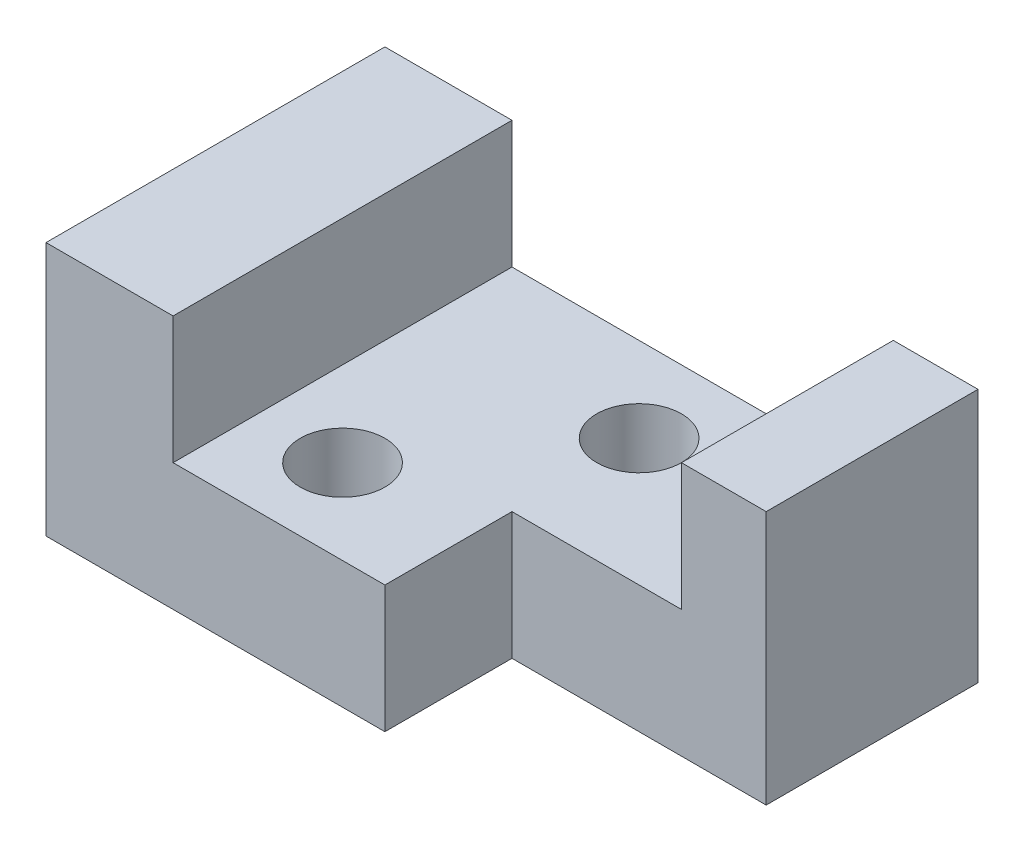
ISO-10303-21;
HEADER;
FILE_DESCRIPTION(('STEP AP214'),'2;1');
FILE_NAME('part.step','',(''),(''),'','','');
FILE_SCHEMA(('AUTOMOTIVE_DESIGN { 1 0 10303 214 1 1 1 1 }'));
ENDSEC;
DATA;
#1=APPLICATION_CONTEXT('core data for automotive mechanical design processes');
#2=APPLICATION_PROTOCOL_DEFINITION('international standard','automotive_design',2000,#1);
#3=PRODUCT_CONTEXT('',#1,'mechanical');
#4=PRODUCT('Part','Part','',(#3));
#5=PRODUCT_RELATED_PRODUCT_CATEGORY('part','',(#4));
#6=PRODUCT_DEFINITION_FORMATION('','',#4);
#7=PRODUCT_DEFINITION_CONTEXT('part definition',#1,'design');
#8=PRODUCT_DEFINITION('design','',#6,#7);
#9=PRODUCT_DEFINITION_SHAPE('','',#8);
#10=(LENGTH_UNIT() NAMED_UNIT(*) SI_UNIT(.MILLI.,.METRE.));
#11=(NAMED_UNIT(*) PLANE_ANGLE_UNIT() SI_UNIT($,.RADIAN.));
#12=(NAMED_UNIT(*) SI_UNIT($,.STERADIAN.) SOLID_ANGLE_UNIT());
#13=UNCERTAINTY_MEASURE_WITH_UNIT(LENGTH_MEASURE(1.E-05),#10,'distance_accuracy_value','');
#14=(GEOMETRIC_REPRESENTATION_CONTEXT(3) GLOBAL_UNCERTAINTY_ASSIGNED_CONTEXT((#13)) GLOBAL_UNIT_ASSIGNED_CONTEXT((#10,
#11,#12)) REPRESENTATION_CONTEXT('',''));
#15=CARTESIAN_POINT('',(0.,0.,0.));
#16=DIRECTION('',(0.,0.,1.));
#17=DIRECTION('',(1.,0.,0.));
#18=AXIS2_PLACEMENT_3D('',#15,#16,#17);
#19=CARTESIAN_POINT('',(-47.625,38.1,25.4));
#20=DIRECTION('',(1.,0.,0.));
#21=DIRECTION('',(0.,1.,0.));
#22=AXIS2_PLACEMENT_3D('',#19,#20,#21);
#23=PLANE('',#22);
#24=DIRECTION('',(0.,-1.,0.));
#25=VECTOR('',#24,1.);
#26=CARTESIAN_POINT('',(-47.625,38.1,-25.4));
#27=LINE('',#26,#25);
#28=CARTESIAN_POINT('',(-47.625,38.1,-25.4));
#29=VERTEX_POINT('',#28);
#30=CARTESIAN_POINT('',(-47.625,0.,-25.4));
#31=VERTEX_POINT('',#30);
#32=EDGE_CURVE('E196',#29,#31,#27,.T.);
#33=ORIENTED_EDGE('',*,*,#32,.T.);
#34=DIRECTION('',(0.,0.,-1.));
#35=VECTOR('',#34,1.);
#36=CARTESIAN_POINT('',(-47.625,0.,25.4));
#37=LINE('',#36,#35);
#38=CARTESIAN_POINT('',(-47.625,0.,25.4));
#39=VERTEX_POINT('',#38);
#40=EDGE_CURVE('E161',#39,#31,#37,.T.);
#41=ORIENTED_EDGE('',*,*,#40,.F.);
#42=DIRECTION('',(0.,-1.,0.));
#43=VECTOR('',#42,1.);
#44=CARTESIAN_POINT('',(-47.625,38.1,25.4));
#45=LINE('',#44,#43);
#46=CARTESIAN_POINT('',(-47.625,38.1,25.4));
#47=VERTEX_POINT('',#46);
#48=EDGE_CURVE('E179',#47,#39,#45,.T.);
#49=ORIENTED_EDGE('',*,*,#48,.F.);
#50=DIRECTION('',(0.,0.,-1.));
#51=VECTOR('',#50,1.);
#52=CARTESIAN_POINT('',(-47.625,38.1,25.4));
#53=LINE('',#52,#51);
#54=EDGE_CURVE('E195',#47,#29,#53,.T.);
#55=ORIENTED_EDGE('',*,*,#54,.T.);
#56=EDGE_LOOP('',(#33,#41,#49,#55));
#57=FACE_BOUND('',#56,.T.);
#58=ADVANCED_FACE('F42',(#57),#23,.F.);
#59=CARTESIAN_POINT('',(-47.625,0.,25.4));
#60=DIRECTION('',(0.,1.,0.));
#61=DIRECTION('',(-1.,0.,0.));
#62=AXIS2_PLACEMENT_3D('',#59,#60,#61);
#63=PLANE('',#62);
#64=CARTESIAN_POINT('',(-15.875,0.,12.7));
#65=DIRECTION('',(0.,1.,0.));
#66=DIRECTION('',(0.,0.,1.));
#67=AXIS2_PLACEMENT_3D('',#64,#65,#66);
#68=CIRCLE('',#67,6.35);
#69=CARTESIAN_POINT('',(-15.875,0.,19.05));
#70=VERTEX_POINT('',#69);
#71=EDGE_CURVE('E291',#70,#70,#68,.T.);
#72=ORIENTED_EDGE('',*,*,#71,.T.);
#73=EDGE_LOOP('',(#72));
#74=FACE_BOUND('',#73,.T.);
#75=CARTESIAN_POINT('',(3.17499999999999,0.,-12.7));
#76=DIRECTION('',(0.,1.,0.));
#77=DIRECTION('',(0.,0.,1.));
#78=AXIS2_PLACEMENT_3D('',#75,#76,#77);
#79=CIRCLE('',#78,6.35);
#80=CARTESIAN_POINT('',(3.17499999999999,0.,-6.35));
#81=VERTEX_POINT('',#80);
#82=EDGE_CURVE('E175',#81,#81,#79,.T.);
#83=ORIENTED_EDGE('',*,*,#82,.T.);
#84=EDGE_LOOP('',(#83));
#85=FACE_BOUND('',#84,.T.);
#86=DIRECTION('',(0.,0.,-1.));
#87=VECTOR('',#86,1.);
#88=CARTESIAN_POINT('',(41.275,0.,25.4));
#89=LINE('',#88,#87);
#90=CARTESIAN_POINT('',(41.275,0.,6.34999999999999));
#91=VERTEX_POINT('',#90);
#92=CARTESIAN_POINT('',(41.275,0.,-25.4));
#93=VERTEX_POINT('',#92);
#94=EDGE_CURVE('E157',#91,#93,#89,.T.);
#95=ORIENTED_EDGE('',*,*,#94,.F.);
#96=DIRECTION('',(1.,0.,0.));
#97=VECTOR('',#96,1.);
#98=CARTESIAN_POINT('',(3.17499999999999,0.,6.34999999999999));
#99=LINE('',#98,#97);
#100=CARTESIAN_POINT('',(3.17499999999999,0.,6.34999999999999));
#101=VERTEX_POINT('',#100);
#102=EDGE_CURVE('E136',#101,#91,#99,.T.);
#103=ORIENTED_EDGE('',*,*,#102,.F.);
#104=DIRECTION('',(0.,0.,-1.));
#105=VECTOR('',#104,1.);
#106=CARTESIAN_POINT('',(3.17499999999999,0.,25.4));
#107=LINE('',#106,#105);
#108=CARTESIAN_POINT('',(3.17499999999999,0.,25.4));
#109=VERTEX_POINT('',#108);
#110=EDGE_CURVE('E171',#109,#101,#107,.T.);
#111=ORIENTED_EDGE('',*,*,#110,.F.);
#112=DIRECTION('',(1.,0.,0.));
#113=VECTOR('',#112,1.);
#114=CARTESIAN_POINT('',(-47.625,0.,25.4));
#115=LINE('',#114,#113);
#116=EDGE_CURVE('E107',#39,#109,#115,.T.);
#117=ORIENTED_EDGE('',*,*,#116,.F.);
#118=ORIENTED_EDGE('',*,*,#40,.T.);
#119=DIRECTION('',(1.,0.,0.));
#120=VECTOR('',#119,1.);
#121=CARTESIAN_POINT('',(-47.625,0.,-25.4));
#122=LINE('',#121,#120);
#123=EDGE_CURVE('E200',#31,#93,#122,.T.);
#124=ORIENTED_EDGE('',*,*,#123,.T.);
#125=EDGE_LOOP('',(#95,#103,#111,#117,#118,#124));
#126=FACE_BOUND('',#125,.T.);
#127=ADVANCED_FACE('F173',(#74,#85,#126),#63,.F.);
#128=CARTESIAN_POINT('',(41.275,0.,25.4));
#129=DIRECTION('',(-1.,0.,0.));
#130=DIRECTION('',(0.,-1.,0.));
#131=AXIS2_PLACEMENT_3D('',#128,#129,#130);
#132=PLANE('',#131);
#133=DIRECTION('',(0.,0.,-1.));
#134=VECTOR('',#133,1.);
#135=CARTESIAN_POINT('',(41.275,38.1,25.4));
#136=LINE('',#135,#134);
#137=CARTESIAN_POINT('',(41.275,38.1,6.34999999999999));
#138=VERTEX_POINT('',#137);
#139=CARTESIAN_POINT('',(41.275,38.1,-25.4));
#140=VERTEX_POINT('',#139);
#141=EDGE_CURVE('E147',#138,#140,#136,.T.);
#142=ORIENTED_EDGE('',*,*,#141,.F.);
#143=DIRECTION('',(0.,-1.,0.));
#144=VECTOR('',#143,1.);
#145=CARTESIAN_POINT('',(41.275,38.1,6.34999999999999));
#146=LINE('',#145,#144);
#147=EDGE_CURVE('E130',#138,#91,#146,.T.);
#148=ORIENTED_EDGE('',*,*,#147,.T.);
#149=ORIENTED_EDGE('',*,*,#94,.T.);
#150=DIRECTION('',(0.,1.,0.));
#151=VECTOR('',#150,1.);
#152=CARTESIAN_POINT('',(41.275,0.,-25.4));
#153=LINE('',#152,#151);
#154=EDGE_CURVE('E154',#93,#140,#153,.T.);
#155=ORIENTED_EDGE('',*,*,#154,.T.);
#156=EDGE_LOOP('',(#142,#148,#149,#155));
#157=FACE_BOUND('',#156,.T.);
#158=ADVANCED_FACE('F152',(#157),#132,.F.);
#159=CARTESIAN_POINT('',(41.275,38.1,25.4));
#160=DIRECTION('',(0.,-1.,0.));
#161=DIRECTION('',(1.,0.,0.));
#162=AXIS2_PLACEMENT_3D('',#159,#160,#161);
#163=PLANE('',#162);
#164=DIRECTION('',(0.,0.,-1.));
#165=VECTOR('',#164,1.);
#166=CARTESIAN_POINT('',(28.575,38.1,25.4));
#167=LINE('',#166,#165);
#168=CARTESIAN_POINT('',(28.575,38.1,6.34999999999999));
#169=VERTEX_POINT('',#168);
#170=CARTESIAN_POINT('',(28.575,38.1,-25.4));
#171=VERTEX_POINT('',#170);
#172=EDGE_CURVE('E149',#169,#171,#167,.T.);
#173=ORIENTED_EDGE('',*,*,#172,.F.);
#174=DIRECTION('',(1.,0.,0.));
#175=VECTOR('',#174,1.);
#176=CARTESIAN_POINT('',(3.17499999999999,38.1,6.34999999999999));
#177=LINE('',#176,#175);
#178=EDGE_CURVE('E133',#169,#138,#177,.T.);
#179=ORIENTED_EDGE('',*,*,#178,.T.);
#180=ORIENTED_EDGE('',*,*,#141,.T.);
#181=DIRECTION('',(-1.,0.,0.));
#182=VECTOR('',#181,1.);
#183=CARTESIAN_POINT('',(41.275,38.1,-25.4));
#184=LINE('',#183,#182);
#185=EDGE_CURVE('E207',#140,#171,#184,.T.);
#186=ORIENTED_EDGE('',*,*,#185,.T.);
#187=EDGE_LOOP('',(#173,#179,#180,#186));
#188=FACE_BOUND('',#187,.T.);
#189=ADVANCED_FACE('F145',(#188),#163,.F.);
#190=CARTESIAN_POINT('',(28.575,38.1,25.4));
#191=DIRECTION('',(1.,0.,0.));
#192=DIRECTION('',(0.,1.,0.));
#193=AXIS2_PLACEMENT_3D('',#190,#191,#192);
#194=PLANE('',#193);
#195=DIRECTION('',(0.,0.,-1.));
#196=VECTOR('',#195,1.);
#197=CARTESIAN_POINT('',(28.575,19.05,25.4));
#198=LINE('',#197,#196);
#199=CARTESIAN_POINT('',(28.575,19.05,6.34999999999999));
#200=VERTEX_POINT('',#199);
#201=CARTESIAN_POINT('',(28.575,19.05,-25.4));
#202=VERTEX_POINT('',#201);
#203=EDGE_CURVE('E163',#200,#202,#198,.T.);
#204=ORIENTED_EDGE('',*,*,#203,.F.);
#205=DIRECTION('',(0.,1.,0.));
#206=VECTOR('',#205,1.);
#207=CARTESIAN_POINT('',(28.575,38.1,6.34999999999999));
#208=LINE('',#207,#206);
#209=EDGE_CURVE('E201',#200,#169,#208,.T.);
#210=ORIENTED_EDGE('',*,*,#209,.T.);
#211=ORIENTED_EDGE('',*,*,#172,.T.);
#212=DIRECTION('',(0.,-1.,0.));
#213=VECTOR('',#212,1.);
#214=CARTESIAN_POINT('',(28.575,38.1,-25.4));
#215=LINE('',#214,#213);
#216=EDGE_CURVE('E210',#171,#202,#215,.T.);
#217=ORIENTED_EDGE('',*,*,#216,.T.);
#218=EDGE_LOOP('',(#204,#210,#211,#217));
#219=FACE_BOUND('',#218,.T.);
#220=ADVANCED_FACE('F238',(#219),#194,.F.);
#221=CARTESIAN_POINT('',(28.575,19.05,25.4));
#222=DIRECTION('',(0.,-1.,0.));
#223=DIRECTION('',(0.,0.,-1.));
#224=AXIS2_PLACEMENT_3D('',#221,#222,#223);
#225=PLANE('',#224);
#226=CARTESIAN_POINT('',(-15.875,19.05,12.7));
#227=DIRECTION('',(0.,1.,0.));
#228=DIRECTION('',(0.,0.,1.));
#229=AXIS2_PLACEMENT_3D('',#226,#227,#228);
#230=CIRCLE('',#229,6.34999999999999);
#231=CARTESIAN_POINT('',(-15.875,19.05,19.05));
#232=VERTEX_POINT('',#231);
#233=EDGE_CURVE('E294',#232,#232,#230,.T.);
#234=ORIENTED_EDGE('',*,*,#233,.F.);
#235=EDGE_LOOP('',(#234));
#236=FACE_BOUND('',#235,.T.);
#237=CARTESIAN_POINT('',(3.17499999999999,19.05,-12.7));
#238=DIRECTION('',(0.,1.,0.));
#239=DIRECTION('',(0.,0.,1.));
#240=AXIS2_PLACEMENT_3D('',#237,#238,#239);
#241=CIRCLE('',#240,6.34999999999999);
#242=CARTESIAN_POINT('',(3.17499999999999,19.05,-6.35000000000001));
#243=VERTEX_POINT('',#242);
#244=EDGE_CURVE('E298',#243,#243,#241,.T.);
#245=ORIENTED_EDGE('',*,*,#244,.F.);
#246=EDGE_LOOP('',(#245));
#247=FACE_BOUND('',#246,.T.);
#248=DIRECTION('',(0.,0.,-1.));
#249=VECTOR('',#248,1.);
#250=CARTESIAN_POINT('',(3.17499999999999,19.05,25.4));
#251=LINE('',#250,#249);
#252=CARTESIAN_POINT('',(3.17499999999999,19.05,25.4));
#253=VERTEX_POINT('',#252);
#254=CARTESIAN_POINT('',(3.17499999999999,19.05,6.34999999999999));
#255=VERTEX_POINT('',#254);
#256=EDGE_CURVE('E57',#253,#255,#251,.T.);
#257=ORIENTED_EDGE('',*,*,#256,.T.);
#258=DIRECTION('',(1.,0.,0.));
#259=VECTOR('',#258,1.);
#260=CARTESIAN_POINT('',(28.575,19.05,6.34999999999999));
#261=LINE('',#260,#259);
#262=EDGE_CURVE('E11',#255,#200,#261,.T.);
#263=ORIENTED_EDGE('',*,*,#262,.T.);
#264=ORIENTED_EDGE('',*,*,#203,.T.);
#265=DIRECTION('',(-1.,0.,0.));
#266=VECTOR('',#265,1.);
#267=CARTESIAN_POINT('',(28.575,19.05,-25.4));
#268=LINE('',#267,#266);
#269=CARTESIAN_POINT('',(-28.575,19.05,-25.4));
#270=VERTEX_POINT('',#269);
#271=EDGE_CURVE('E214',#202,#270,#268,.T.);
#272=ORIENTED_EDGE('',*,*,#271,.T.);
#273=DIRECTION('',(0.,0.,-1.));
#274=VECTOR('',#273,1.);
#275=CARTESIAN_POINT('',(-28.575,19.05,25.4));
#276=LINE('',#275,#274);
#277=CARTESIAN_POINT('',(-28.575,19.05,25.4));
#278=VERTEX_POINT('',#277);
#279=EDGE_CURVE('E227',#278,#270,#276,.T.);
#280=ORIENTED_EDGE('',*,*,#279,.F.);
#281=DIRECTION('',(-1.,0.,0.));
#282=VECTOR('',#281,1.);
#283=CARTESIAN_POINT('',(28.575,19.05,25.4));
#284=LINE('',#283,#282);
#285=EDGE_CURVE('E182',#253,#278,#284,.T.);
#286=ORIENTED_EDGE('',*,*,#285,.F.);
#287=EDGE_LOOP('',(#257,#263,#264,#272,#280,#286));
#288=FACE_BOUND('',#287,.T.);
#289=ADVANCED_FACE('F233',(#236,#247,#288),#225,.F.);
#290=CARTESIAN_POINT('',(-28.575,19.05,25.4));
#291=DIRECTION('',(-1.,0.,0.));
#292=DIRECTION('',(0.,-1.,0.));
#293=AXIS2_PLACEMENT_3D('',#290,#291,#292);
#294=PLANE('',#293);
#295=DIRECTION('',(0.,1.,0.));
#296=VECTOR('',#295,1.);
#297=CARTESIAN_POINT('',(-28.575,19.05,-25.4));
#298=LINE('',#297,#296);
#299=CARTESIAN_POINT('',(-28.575,38.1,-25.4));
#300=VERTEX_POINT('',#299);
#301=EDGE_CURVE('E217',#270,#300,#298,.T.);
#302=ORIENTED_EDGE('',*,*,#301,.T.);
#303=DIRECTION('',(0.,0.,-1.));
#304=VECTOR('',#303,1.);
#305=CARTESIAN_POINT('',(-28.575,38.1,25.4));
#306=LINE('',#305,#304);
#307=CARTESIAN_POINT('',(-28.575,38.1,25.4));
#308=VERTEX_POINT('',#307);
#309=EDGE_CURVE('E224',#308,#300,#306,.T.);
#310=ORIENTED_EDGE('',*,*,#309,.F.);
#311=DIRECTION('',(0.,1.,0.));
#312=VECTOR('',#311,1.);
#313=CARTESIAN_POINT('',(-28.575,19.05,25.4));
#314=LINE('',#313,#312);
#315=EDGE_CURVE('E186',#278,#308,#314,.T.);
#316=ORIENTED_EDGE('',*,*,#315,.F.);
#317=ORIENTED_EDGE('',*,*,#279,.T.);
#318=EDGE_LOOP('',(#302,#310,#316,#317));
#319=FACE_BOUND('',#318,.T.);
#320=ADVANCED_FACE('F245',(#319),#294,.F.);
#321=CARTESIAN_POINT('',(-28.575,38.1,25.4));
#322=DIRECTION('',(0.,-1.,0.));
#323=DIRECTION('',(0.,0.,-1.));
#324=AXIS2_PLACEMENT_3D('',#321,#322,#323);
#325=PLANE('',#324);
#326=DIRECTION('',(-1.,0.,0.));
#327=VECTOR('',#326,1.);
#328=CARTESIAN_POINT('',(-28.575,38.1,-25.4));
#329=LINE('',#328,#327);
#330=EDGE_CURVE('E99',#300,#29,#329,.T.);
#331=ORIENTED_EDGE('',*,*,#330,.T.);
#332=ORIENTED_EDGE('',*,*,#54,.F.);
#333=DIRECTION('',(-1.,0.,0.));
#334=VECTOR('',#333,1.);
#335=CARTESIAN_POINT('',(-28.575,38.1,25.4));
#336=LINE('',#335,#334);
#337=EDGE_CURVE('E66',#308,#47,#336,.T.);
#338=ORIENTED_EDGE('',*,*,#337,.F.);
#339=ORIENTED_EDGE('',*,*,#309,.T.);
#340=EDGE_LOOP('',(#331,#332,#338,#339));
#341=FACE_BOUND('',#340,.T.);
#342=ADVANCED_FACE('F247',(#341),#325,.F.);
#343=CARTESIAN_POINT('',(0.,0.,25.4));
#344=DIRECTION('',(0.,0.,1.));
#345=DIRECTION('',(1.,0.,0.));
#346=AXIS2_PLACEMENT_3D('',#343,#344,#345);
#347=PLANE('',#346);
#348=DIRECTION('',(0.,-1.,0.));
#349=VECTOR('',#348,1.);
#350=CARTESIAN_POINT('',(3.17499999999999,0.,25.4));
#351=LINE('',#350,#349);
#352=EDGE_CURVE('E50',#253,#109,#351,.T.);
#353=ORIENTED_EDGE('',*,*,#352,.F.);
#354=ORIENTED_EDGE('',*,*,#285,.T.);
#355=ORIENTED_EDGE('',*,*,#315,.T.);
#356=ORIENTED_EDGE('',*,*,#337,.T.);
#357=ORIENTED_EDGE('',*,*,#48,.T.);
#358=ORIENTED_EDGE('',*,*,#116,.T.);
#359=EDGE_LOOP('',(#353,#354,#355,#356,#357,#358));
#360=FACE_BOUND('',#359,.T.);
#361=ADVANCED_FACE('F177',(#360),#347,.T.);
#362=CARTESIAN_POINT('',(0.,0.,-25.4));
#363=DIRECTION('',(0.,0.,1.));
#364=DIRECTION('',(1.,0.,0.));
#365=AXIS2_PLACEMENT_3D('',#362,#363,#364);
#366=PLANE('',#365);
#367=ORIENTED_EDGE('',*,*,#32,.F.);
#368=ORIENTED_EDGE('',*,*,#330,.F.);
#369=ORIENTED_EDGE('',*,*,#301,.F.);
#370=ORIENTED_EDGE('',*,*,#271,.F.);
#371=ORIENTED_EDGE('',*,*,#216,.F.);
#372=ORIENTED_EDGE('',*,*,#185,.F.);
#373=ORIENTED_EDGE('',*,*,#154,.F.);
#374=ORIENTED_EDGE('',*,*,#123,.F.);
#375=EDGE_LOOP('',(#367,#368,#369,#370,#371,#372,#373,#374));
#376=FACE_BOUND('',#375,.T.);
#377=ADVANCED_FACE('F242',(#376),#366,.F.);
#378=CARTESIAN_POINT('',(3.17499999999999,38.1,6.34999999999999));
#379=DIRECTION('',(0.,0.,-1.));
#380=DIRECTION('',(-1.,0.,0.));
#381=AXIS2_PLACEMENT_3D('',#378,#379,#380);
#382=PLANE('',#381);
#383=ORIENTED_EDGE('',*,*,#262,.F.);
#384=DIRECTION('',(0.,-1.,0.));
#385=VECTOR('',#384,1.);
#386=CARTESIAN_POINT('',(3.17499999999999,38.1,6.34999999999999));
#387=LINE('',#386,#385);
#388=EDGE_CURVE('E141',#255,#101,#387,.T.);
#389=ORIENTED_EDGE('',*,*,#388,.T.);
#390=ORIENTED_EDGE('',*,*,#102,.T.);
#391=ORIENTED_EDGE('',*,*,#147,.F.);
#392=ORIENTED_EDGE('',*,*,#178,.F.);
#393=ORIENTED_EDGE('',*,*,#209,.F.);
#394=EDGE_LOOP('',(#383,#389,#390,#391,#392,#393));
#395=FACE_BOUND('',#394,.T.);
#396=ADVANCED_FACE('F132',(#395),#382,.F.);
#397=CARTESIAN_POINT('',(3.17499999999999,38.1,25.4));
#398=DIRECTION('',(-1.,0.,0.));
#399=DIRECTION('',(0.,-1.,0.));
#400=AXIS2_PLACEMENT_3D('',#397,#398,#399);
#401=PLANE('',#400);
#402=ORIENTED_EDGE('',*,*,#352,.T.);
#403=ORIENTED_EDGE('',*,*,#110,.T.);
#404=ORIENTED_EDGE('',*,*,#388,.F.);
#405=ORIENTED_EDGE('',*,*,#256,.F.);
#406=EDGE_LOOP('',(#402,#403,#404,#405));
#407=FACE_BOUND('',#406,.T.);
#408=ADVANCED_FACE('F170',(#407),#401,.F.);
#409=CARTESIAN_POINT('',(3.17499999999999,19.05,-12.7));
#410=DIRECTION('',(0.,1.,0.));
#411=DIRECTION('',(0.,0.,1.));
#412=AXIS2_PLACEMENT_3D('',#409,#410,#411);
#413=CYLINDRICAL_SURFACE('',#412,6.34999999999999);
#414=ORIENTED_EDGE('',*,*,#82,.F.);
#415=EDGE_LOOP('',(#414));
#416=FACE_BOUND('',#415,.T.);
#417=ORIENTED_EDGE('',*,*,#244,.T.);
#418=EDGE_LOOP('',(#417));
#419=FACE_BOUND('',#418,.T.);
#420=ADVANCED_FACE('F278',(#416,#419),#413,.F.);
#421=CARTESIAN_POINT('',(-15.875,19.05,12.7));
#422=DIRECTION('',(0.,1.,0.));
#423=DIRECTION('',(0.,0.,1.));
#424=AXIS2_PLACEMENT_3D('',#421,#422,#423);
#425=CYLINDRICAL_SURFACE('',#424,6.34999999999999);
#426=ORIENTED_EDGE('',*,*,#71,.F.);
#427=EDGE_LOOP('',(#426));
#428=FACE_BOUND('',#427,.T.);
#429=ORIENTED_EDGE('',*,*,#233,.T.);
#430=EDGE_LOOP('',(#429));
#431=FACE_BOUND('',#430,.T.);
#432=ADVANCED_FACE('F283',(#428,#431),#425,.F.);
#433=CLOSED_SHELL('',(#58,#127,#158,#189,#220,#289,#320,#342,#361,#377,#396,#408,#420,#432));
#434=MANIFOLD_SOLID_BREP('B2',#433);
#435=ADVANCED_BREP_SHAPE_REPRESENTATION('',(#18,#434),#14);
#436=SHAPE_DEFINITION_REPRESENTATION(#9,#435);
ENDSEC;
END-ISO-10303-21;
